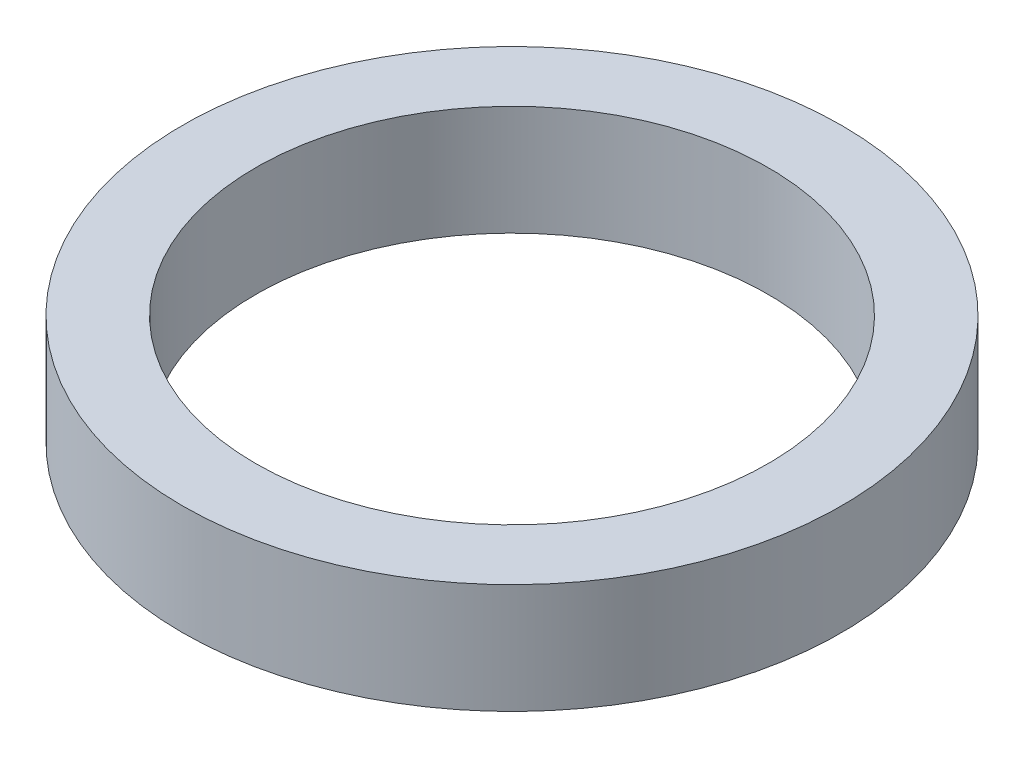
ISO-10303-21;
HEADER;
FILE_DESCRIPTION(('STEP AP214'),'2;1');
FILE_NAME('part.step','',(''),(''),'','','');
FILE_SCHEMA(('AUTOMOTIVE_DESIGN { 1 0 10303 214 1 1 1 1 }'));
ENDSEC;
DATA;
#1=APPLICATION_CONTEXT('core data for automotive mechanical design processes');
#2=APPLICATION_PROTOCOL_DEFINITION('international standard','automotive_design',2000,#1);
#3=PRODUCT_CONTEXT('',#1,'mechanical');
#4=PRODUCT('Part','Part','',(#3));
#5=PRODUCT_RELATED_PRODUCT_CATEGORY('part','',(#4));
#6=PRODUCT_DEFINITION_FORMATION('','',#4);
#7=PRODUCT_DEFINITION_CONTEXT('part definition',#1,'design');
#8=PRODUCT_DEFINITION('design','',#6,#7);
#9=PRODUCT_DEFINITION_SHAPE('','',#8);
#10=(LENGTH_UNIT() NAMED_UNIT(*) SI_UNIT(.MILLI.,.METRE.));
#11=(NAMED_UNIT(*) PLANE_ANGLE_UNIT() SI_UNIT($,.RADIAN.));
#12=(NAMED_UNIT(*) SI_UNIT($,.STERADIAN.) SOLID_ANGLE_UNIT());
#13=UNCERTAINTY_MEASURE_WITH_UNIT(LENGTH_MEASURE(1.E-05),#10,'distance_accuracy_value','');
#14=(GEOMETRIC_REPRESENTATION_CONTEXT(3) GLOBAL_UNCERTAINTY_ASSIGNED_CONTEXT((#13)) GLOBAL_UNIT_ASSIGNED_CONTEXT((#10,
#11,#12)) REPRESENTATION_CONTEXT('',''));
#15=CARTESIAN_POINT('',(0.,0.,0.));
#16=DIRECTION('',(0.,0.,1.));
#17=DIRECTION('',(1.,0.,0.));
#18=AXIS2_PLACEMENT_3D('',#15,#16,#17);
#19=CARTESIAN_POINT('',(0.,1.5,0.));
#20=DIRECTION('',(0.,1.,0.));
#21=DIRECTION('',(0.,0.,1.));
#22=AXIS2_PLACEMENT_3D('',#19,#20,#21);
#23=PLANE('',#22);
#24=CARTESIAN_POINT('',(0.,1.5,0.));
#25=DIRECTION('',(0.,1.,0.));
#26=DIRECTION('',(0.,0.,1.));
#27=AXIS2_PLACEMENT_3D('',#24,#25,#26);
#28=CIRCLE('',#27,4.5);
#29=CARTESIAN_POINT('',(0.,1.5,4.5));
#30=VERTEX_POINT('',#29);
#31=EDGE_CURVE('E10',#30,#30,#28,.T.);
#32=ORIENTED_EDGE('',*,*,#31,.T.);
#33=EDGE_LOOP('',(#32));
#34=FACE_BOUND('',#33,.T.);
#35=CARTESIAN_POINT('',(0.,1.5,0.));
#36=DIRECTION('',(0.,1.,0.));
#37=DIRECTION('',(0.,0.,1.));
#38=AXIS2_PLACEMENT_3D('',#35,#36,#37);
#39=CIRCLE('',#38,3.5);
#40=CARTESIAN_POINT('',(0.,1.5,3.5));
#41=VERTEX_POINT('',#40);
#42=EDGE_CURVE('E50',#41,#41,#39,.T.);
#43=ORIENTED_EDGE('',*,*,#42,.F.);
#44=EDGE_LOOP('',(#43));
#45=FACE_BOUND('',#44,.T.);
#46=ADVANCED_FACE('F39',(#34,#45),#23,.T.);
#47=CARTESIAN_POINT('',(0.,0.,0.));
#48=DIRECTION('',(0.,1.,0.));
#49=DIRECTION('',(0.,0.,1.));
#50=AXIS2_PLACEMENT_3D('',#47,#48,#49);
#51=PLANE('',#50);
#52=CARTESIAN_POINT('',(0.,0.,0.));
#53=DIRECTION('',(0.,1.,0.));
#54=DIRECTION('',(0.,0.,1.));
#55=AXIS2_PLACEMENT_3D('',#52,#53,#54);
#56=CIRCLE('',#55,4.5);
#57=CARTESIAN_POINT('',(0.,0.,4.5));
#58=VERTEX_POINT('',#57);
#59=EDGE_CURVE('E43',#58,#58,#56,.T.);
#60=ORIENTED_EDGE('',*,*,#59,.F.);
#61=EDGE_LOOP('',(#60));
#62=FACE_BOUND('',#61,.T.);
#63=CARTESIAN_POINT('',(0.,0.,0.));
#64=DIRECTION('',(0.,1.,0.));
#65=DIRECTION('',(0.,0.,1.));
#66=AXIS2_PLACEMENT_3D('',#63,#64,#65);
#67=CIRCLE('',#66,3.5);
#68=CARTESIAN_POINT('',(0.,0.,3.5));
#69=VERTEX_POINT('',#68);
#70=EDGE_CURVE('E52',#69,#69,#67,.T.);
#71=ORIENTED_EDGE('',*,*,#70,.T.);
#72=EDGE_LOOP('',(#71));
#73=FACE_BOUND('',#72,.T.);
#74=ADVANCED_FACE('F62',(#62,#73),#51,.F.);
#75=CARTESIAN_POINT('',(0.,1.5,0.));
#76=DIRECTION('',(0.,-1.,0.));
#77=DIRECTION('',(0.,0.,-1.));
#78=AXIS2_PLACEMENT_3D('',#75,#76,#77);
#79=CYLINDRICAL_SURFACE('',#78,4.5);
#80=ORIENTED_EDGE('',*,*,#31,.F.);
#81=EDGE_LOOP('',(#80));
#82=FACE_BOUND('',#81,.T.);
#83=ORIENTED_EDGE('',*,*,#59,.T.);
#84=EDGE_LOOP('',(#83));
#85=FACE_BOUND('',#84,.T.);
#86=ADVANCED_FACE('F41',(#82,#85),#79,.T.);
#87=CARTESIAN_POINT('',(0.,1.5,0.));
#88=DIRECTION('',(0.,-1.,0.));
#89=DIRECTION('',(0.,0.,-1.));
#90=AXIS2_PLACEMENT_3D('',#87,#88,#89);
#91=CYLINDRICAL_SURFACE('',#90,3.5);
#92=ORIENTED_EDGE('',*,*,#42,.T.);
#93=EDGE_LOOP('',(#92));
#94=FACE_BOUND('',#93,.T.);
#95=ORIENTED_EDGE('',*,*,#70,.F.);
#96=EDGE_LOOP('',(#95));
#97=FACE_BOUND('',#96,.T.);
#98=ADVANCED_FACE('F58',(#94,#97),#91,.F.);
#99=CLOSED_SHELL('',(#46,#74,#86,#98));
#100=MANIFOLD_SOLID_BREP('B2',#99);
#101=ADVANCED_BREP_SHAPE_REPRESENTATION('',(#18,#100),#14);
#102=SHAPE_DEFINITION_REPRESENTATION(#9,#101);
ENDSEC;
END-ISO-10303-21;
